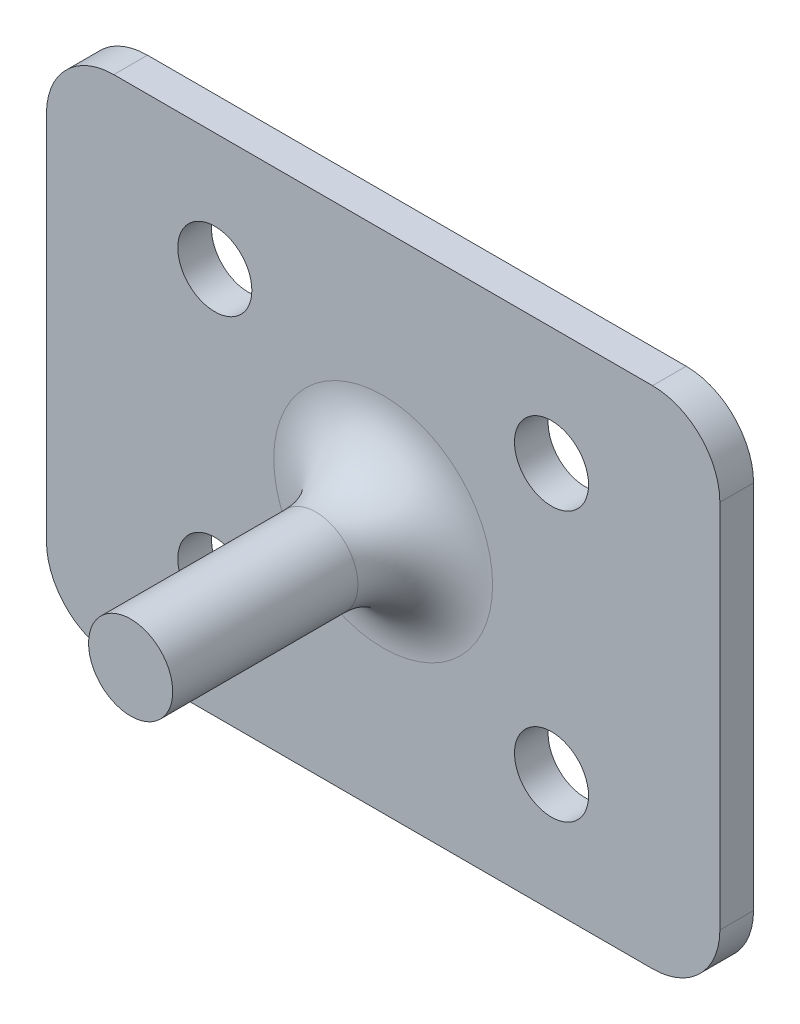
ISO-10303-21;
HEADER;
FILE_DESCRIPTION(('STEP AP214'),'2;1');
FILE_NAME('part.step','',(''),(''),'','','');
FILE_SCHEMA(('AUTOMOTIVE_DESIGN { 1 0 10303 214 1 1 1 1 }'));
ENDSEC;
DATA;
#1=APPLICATION_CONTEXT('core data for automotive mechanical design processes');
#2=APPLICATION_PROTOCOL_DEFINITION('international standard','automotive_design',2000,#1);
#3=PRODUCT_CONTEXT('',#1,'mechanical');
#4=PRODUCT('Part','Part','',(#3));
#5=PRODUCT_RELATED_PRODUCT_CATEGORY('part','',(#4));
#6=PRODUCT_DEFINITION_FORMATION('','',#4);
#7=PRODUCT_DEFINITION_CONTEXT('part definition',#1,'design');
#8=PRODUCT_DEFINITION('design','',#6,#7);
#9=PRODUCT_DEFINITION_SHAPE('','',#8);
#10=(LENGTH_UNIT() NAMED_UNIT(*) SI_UNIT(.MILLI.,.METRE.));
#11=(NAMED_UNIT(*) PLANE_ANGLE_UNIT() SI_UNIT($,.RADIAN.));
#12=(NAMED_UNIT(*) SI_UNIT($,.STERADIAN.) SOLID_ANGLE_UNIT());
#13=UNCERTAINTY_MEASURE_WITH_UNIT(LENGTH_MEASURE(1.E-05),#10,'distance_accuracy_value','');
#14=(GEOMETRIC_REPRESENTATION_CONTEXT(3) GLOBAL_UNCERTAINTY_ASSIGNED_CONTEXT((#13)) GLOBAL_UNIT_ASSIGNED_CONTEXT((#10,
#11,#12)) REPRESENTATION_CONTEXT('',''));
#15=CARTESIAN_POINT('',(0.,0.,0.));
#16=DIRECTION('',(0.,0.,1.));
#17=DIRECTION('',(1.,0.,0.));
#18=AXIS2_PLACEMENT_3D('',#15,#16,#17);
#19=CARTESIAN_POINT('',(16.51,-45.72,2.54));
#20=DIRECTION('',(0.,0.,1.));
#21=DIRECTION('',(1.,0.,0.));
#22=AXIS2_PLACEMENT_3D('',#19,#20,#21);
#23=PLANE('',#22);
#24=CARTESIAN_POINT('',(36.83,-31.75,2.54));
#25=DIRECTION('',(0.,0.,1.));
#26=DIRECTION('',(1.,0.,0.));
#27=AXIS2_PLACEMENT_3D('',#24,#25,#26);
#28=CIRCLE('',#27,8.255);
#29=CARTESIAN_POINT('',(45.085,-31.75,2.54));
#30=VERTEX_POINT('',#29);
#31=EDGE_CURVE('E11',#30,#30,#28,.F.);
#32=ORIENTED_EDGE('',*,*,#31,.T.);
#33=EDGE_LOOP('',(#32));
#34=FACE_BOUND('',#33,.T.);
#35=CARTESIAN_POINT('',(16.51,-45.72,2.54));
#36=DIRECTION('',(0.,0.,1.));
#37=DIRECTION('',(1.,0.,0.));
#38=AXIS2_PLACEMENT_3D('',#35,#36,#37);
#39=CIRCLE('',#38,5.08);
#40=CARTESIAN_POINT('',(11.43,-45.72,2.54));
#41=VERTEX_POINT('',#40);
#42=CARTESIAN_POINT('',(16.51,-50.8,2.54));
#43=VERTEX_POINT('',#42);
#44=EDGE_CURVE('E149',#41,#43,#39,.T.);
#45=ORIENTED_EDGE('',*,*,#44,.T.);
#46=DIRECTION('',(1.,0.,0.));
#47=VECTOR('',#46,1.);
#48=CARTESIAN_POINT('',(16.51,-50.8,2.54));
#49=LINE('',#48,#47);
#50=CARTESIAN_POINT('',(57.15,-50.8,2.54));
#51=VERTEX_POINT('',#50);
#52=EDGE_CURVE('E97',#43,#51,#49,.T.);
#53=ORIENTED_EDGE('',*,*,#52,.T.);
#54=CARTESIAN_POINT('',(57.15,-45.72,2.54));
#55=DIRECTION('',(0.,0.,1.));
#56=DIRECTION('',(1.,0.,0.));
#57=AXIS2_PLACEMENT_3D('',#54,#55,#56);
#58=CIRCLE('',#57,5.08);
#59=CARTESIAN_POINT('',(62.23,-45.72,2.54));
#60=VERTEX_POINT('',#59);
#61=EDGE_CURVE('E223',#51,#60,#58,.T.);
#62=ORIENTED_EDGE('',*,*,#61,.T.);
#63=DIRECTION('',(0.,1.,0.));
#64=VECTOR('',#63,1.);
#65=CARTESIAN_POINT('',(62.23,-17.78,2.54));
#66=LINE('',#65,#64);
#67=CARTESIAN_POINT('',(62.23,-17.78,2.54));
#68=VERTEX_POINT('',#67);
#69=EDGE_CURVE('E228',#60,#68,#66,.T.);
#70=ORIENTED_EDGE('',*,*,#69,.T.);
#71=CARTESIAN_POINT('',(57.15,-17.78,2.54));
#72=DIRECTION('',(0.,0.,1.));
#73=DIRECTION('',(-1.,0.,0.));
#74=AXIS2_PLACEMENT_3D('',#71,#72,#73);
#75=CIRCLE('',#74,5.08);
#76=CARTESIAN_POINT('',(57.15,-12.7,2.54));
#77=VERTEX_POINT('',#76);
#78=EDGE_CURVE('E116',#68,#77,#75,.T.);
#79=ORIENTED_EDGE('',*,*,#78,.T.);
#80=DIRECTION('',(-1.,0.,0.));
#81=VECTOR('',#80,1.);
#82=CARTESIAN_POINT('',(16.51,-12.7,2.54));
#83=LINE('',#82,#81);
#84=CARTESIAN_POINT('',(16.51,-12.7,2.54));
#85=VERTEX_POINT('',#84);
#86=EDGE_CURVE('E110',#77,#85,#83,.T.);
#87=ORIENTED_EDGE('',*,*,#86,.T.);
#88=CARTESIAN_POINT('',(16.51,-17.78,2.54));
#89=DIRECTION('',(0.,0.,1.));
#90=DIRECTION('',(1.,0.,0.));
#91=AXIS2_PLACEMENT_3D('',#88,#89,#90);
#92=CIRCLE('',#91,5.08);
#93=CARTESIAN_POINT('',(11.43,-17.78,2.54));
#94=VERTEX_POINT('',#93);
#95=EDGE_CURVE('E114',#85,#94,#92,.T.);
#96=ORIENTED_EDGE('',*,*,#95,.T.);
#97=DIRECTION('',(0.,-1.,0.));
#98=VECTOR('',#97,1.);
#99=CARTESIAN_POINT('',(11.43,-17.78,2.54));
#100=LINE('',#99,#98);
#101=EDGE_CURVE('E53',#94,#41,#100,.T.);
#102=ORIENTED_EDGE('',*,*,#101,.T.);
#103=EDGE_LOOP('',(#45,#53,#62,#70,#79,#87,#96,#102));
#104=FACE_BOUND('',#103,.T.);
#105=CARTESIAN_POINT('',(24.13,-21.59,2.54));
#106=DIRECTION('',(0.,0.,1.));
#107=DIRECTION('',(1.,0.,0.));
#108=AXIS2_PLACEMENT_3D('',#105,#106,#107);
#109=CIRCLE('',#108,2.794);
#110=CARTESIAN_POINT('',(26.924,-21.59,2.54));
#111=VERTEX_POINT('',#110);
#112=EDGE_CURVE('E234',#111,#111,#109,.T.);
#113=ORIENTED_EDGE('',*,*,#112,.F.);
#114=EDGE_LOOP('',(#113));
#115=FACE_BOUND('',#114,.T.);
#116=CARTESIAN_POINT('',(49.53,-21.59,2.54));
#117=DIRECTION('',(0.,0.,1.));
#118=DIRECTION('',(1.,0.,0.));
#119=AXIS2_PLACEMENT_3D('',#116,#117,#118);
#120=CIRCLE('',#119,2.794);
#121=CARTESIAN_POINT('',(52.324,-21.59,2.54));
#122=VERTEX_POINT('',#121);
#123=EDGE_CURVE('E240',#122,#122,#120,.T.);
#124=ORIENTED_EDGE('',*,*,#123,.F.);
#125=EDGE_LOOP('',(#124));
#126=FACE_BOUND('',#125,.T.);
#127=CARTESIAN_POINT('',(24.13,-41.91,2.54));
#128=DIRECTION('',(0.,0.,1.));
#129=DIRECTION('',(1.,0.,0.));
#130=AXIS2_PLACEMENT_3D('',#127,#128,#129);
#131=CIRCLE('',#130,2.794);
#132=CARTESIAN_POINT('',(26.924,-41.91,2.54));
#133=VERTEX_POINT('',#132);
#134=EDGE_CURVE('E246',#133,#133,#131,.T.);
#135=ORIENTED_EDGE('',*,*,#134,.F.);
#136=EDGE_LOOP('',(#135));
#137=FACE_BOUND('',#136,.T.);
#138=CARTESIAN_POINT('',(49.53,-41.91,2.54));
#139=DIRECTION('',(0.,0.,1.));
#140=DIRECTION('',(1.,0.,0.));
#141=AXIS2_PLACEMENT_3D('',#138,#139,#140);
#142=CIRCLE('',#141,2.794);
#143=CARTESIAN_POINT('',(52.324,-41.91,2.54));
#144=VERTEX_POINT('',#143);
#145=EDGE_CURVE('E252',#144,#144,#142,.T.);
#146=ORIENTED_EDGE('',*,*,#145,.F.);
#147=EDGE_LOOP('',(#146));
#148=FACE_BOUND('',#147,.T.);
#149=ADVANCED_FACE('F36',(#34,#104,#115,#126,#137,#148),#23,.T.);
#150=CARTESIAN_POINT('',(16.51,-45.72,2.54));
#151=DIRECTION('',(0.,0.,-1.));
#152=DIRECTION('',(-1.,0.,0.));
#153=AXIS2_PLACEMENT_3D('',#150,#151,#152);
#154=CYLINDRICAL_SURFACE('',#153,5.08);
#155=CARTESIAN_POINT('',(16.51,-45.72,0.));
#156=DIRECTION('',(0.,0.,1.));
#157=DIRECTION('',(1.,0.,0.));
#158=AXIS2_PLACEMENT_3D('',#155,#156,#157);
#159=CIRCLE('',#158,5.08);
#160=CARTESIAN_POINT('',(11.43,-45.72,0.));
#161=VERTEX_POINT('',#160);
#162=CARTESIAN_POINT('',(16.51,-50.8,0.));
#163=VERTEX_POINT('',#162);
#164=EDGE_CURVE('E134',#161,#163,#159,.T.);
#165=ORIENTED_EDGE('',*,*,#164,.T.);
#166=DIRECTION('',(0.,0.,-1.));
#167=VECTOR('',#166,1.);
#168=CARTESIAN_POINT('',(16.51,-50.8,2.54));
#169=LINE('',#168,#167);
#170=EDGE_CURVE('E162',#43,#163,#169,.T.);
#171=ORIENTED_EDGE('',*,*,#170,.F.);
#172=ORIENTED_EDGE('',*,*,#44,.F.);
#173=DIRECTION('',(0.,0.,-1.));
#174=VECTOR('',#173,1.);
#175=CARTESIAN_POINT('',(11.43,-45.72,2.54));
#176=LINE('',#175,#174);
#177=EDGE_CURVE('E130',#41,#161,#176,.T.);
#178=ORIENTED_EDGE('',*,*,#177,.T.);
#179=EDGE_LOOP('',(#165,#171,#172,#178));
#180=FACE_BOUND('',#179,.T.);
#181=ADVANCED_FACE('F179',(#180),#154,.T.);
#182=CARTESIAN_POINT('',(16.51,-50.8,2.54));
#183=DIRECTION('',(0.,1.,0.));
#184=DIRECTION('',(0.,0.,1.));
#185=AXIS2_PLACEMENT_3D('',#182,#183,#184);
#186=PLANE('',#185);
#187=DIRECTION('',(1.,0.,0.));
#188=VECTOR('',#187,1.);
#189=CARTESIAN_POINT('',(16.51,-50.8,0.));
#190=LINE('',#189,#188);
#191=CARTESIAN_POINT('',(57.15,-50.8,0.));
#192=VERTEX_POINT('',#191);
#193=EDGE_CURVE('E137',#163,#192,#190,.T.);
#194=ORIENTED_EDGE('',*,*,#193,.T.);
#195=DIRECTION('',(0.,0.,-1.));
#196=VECTOR('',#195,1.);
#197=CARTESIAN_POINT('',(57.15,-50.8,2.54));
#198=LINE('',#197,#196);
#199=EDGE_CURVE('E159',#51,#192,#198,.T.);
#200=ORIENTED_EDGE('',*,*,#199,.F.);
#201=ORIENTED_EDGE('',*,*,#52,.F.);
#202=ORIENTED_EDGE('',*,*,#170,.T.);
#203=EDGE_LOOP('',(#194,#200,#201,#202));
#204=FACE_BOUND('',#203,.T.);
#205=ADVANCED_FACE('F185',(#204),#186,.F.);
#206=CARTESIAN_POINT('',(57.15,-45.72,2.54));
#207=DIRECTION('',(0.,0.,-1.));
#208=DIRECTION('',(-1.,0.,0.));
#209=AXIS2_PLACEMENT_3D('',#206,#207,#208);
#210=CYLINDRICAL_SURFACE('',#209,5.08);
#211=CARTESIAN_POINT('',(57.15,-45.72,0.));
#212=DIRECTION('',(0.,0.,1.));
#213=DIRECTION('',(1.,0.,0.));
#214=AXIS2_PLACEMENT_3D('',#211,#212,#213);
#215=CIRCLE('',#214,5.08);
#216=CARTESIAN_POINT('',(62.23,-45.72,0.));
#217=VERTEX_POINT('',#216);
#218=EDGE_CURVE('E140',#192,#217,#215,.T.);
#219=ORIENTED_EDGE('',*,*,#218,.T.);
#220=DIRECTION('',(0.,0.,-1.));
#221=VECTOR('',#220,1.);
#222=CARTESIAN_POINT('',(62.23,-45.72,2.54));
#223=LINE('',#222,#221);
#224=EDGE_CURVE('E156',#60,#217,#223,.T.);
#225=ORIENTED_EDGE('',*,*,#224,.F.);
#226=ORIENTED_EDGE('',*,*,#61,.F.);
#227=ORIENTED_EDGE('',*,*,#199,.T.);
#228=EDGE_LOOP('',(#219,#225,#226,#227));
#229=FACE_BOUND('',#228,.T.);
#230=ADVANCED_FACE('F209',(#229),#210,.T.);
#231=CARTESIAN_POINT('',(62.23,-17.78,2.54));
#232=DIRECTION('',(-1.,0.,0.));
#233=DIRECTION('',(0.,-1.,0.));
#234=AXIS2_PLACEMENT_3D('',#231,#232,#233);
#235=PLANE('',#234);
#236=DIRECTION('',(0.,1.,0.));
#237=VECTOR('',#236,1.);
#238=CARTESIAN_POINT('',(62.23,-17.78,0.));
#239=LINE('',#238,#237);
#240=CARTESIAN_POINT('',(62.23,-17.78,0.));
#241=VERTEX_POINT('',#240);
#242=EDGE_CURVE('E142',#217,#241,#239,.T.);
#243=ORIENTED_EDGE('',*,*,#242,.T.);
#244=DIRECTION('',(0.,0.,-1.));
#245=VECTOR('',#244,1.);
#246=CARTESIAN_POINT('',(62.23,-17.78,2.54));
#247=LINE('',#246,#245);
#248=EDGE_CURVE('E153',#68,#241,#247,.T.);
#249=ORIENTED_EDGE('',*,*,#248,.F.);
#250=ORIENTED_EDGE('',*,*,#69,.F.);
#251=ORIENTED_EDGE('',*,*,#224,.T.);
#252=EDGE_LOOP('',(#243,#249,#250,#251));
#253=FACE_BOUND('',#252,.T.);
#254=ADVANCED_FACE('F205',(#253),#235,.F.);
#255=CARTESIAN_POINT('',(57.15,-17.78,2.54));
#256=DIRECTION('',(0.,0.,-1.));
#257=DIRECTION('',(-1.,0.,0.));
#258=AXIS2_PLACEMENT_3D('',#255,#256,#257);
#259=CYLINDRICAL_SURFACE('',#258,5.08);
#260=CARTESIAN_POINT('',(57.15,-17.78,0.));
#261=DIRECTION('',(0.,0.,1.));
#262=DIRECTION('',(-1.,0.,0.));
#263=AXIS2_PLACEMENT_3D('',#260,#261,#262);
#264=CIRCLE('',#263,5.08);
#265=CARTESIAN_POINT('',(57.15,-12.7,0.));
#266=VERTEX_POINT('',#265);
#267=EDGE_CURVE('E144',#241,#266,#264,.T.);
#268=ORIENTED_EDGE('',*,*,#267,.T.);
#269=DIRECTION('',(0.,0.,-1.));
#270=VECTOR('',#269,1.);
#271=CARTESIAN_POINT('',(57.15,-12.7,2.54));
#272=LINE('',#271,#270);
#273=EDGE_CURVE('E125',#77,#266,#272,.T.);
#274=ORIENTED_EDGE('',*,*,#273,.F.);
#275=ORIENTED_EDGE('',*,*,#78,.F.);
#276=ORIENTED_EDGE('',*,*,#248,.T.);
#277=EDGE_LOOP('',(#268,#274,#275,#276));
#278=FACE_BOUND('',#277,.T.);
#279=ADVANCED_FACE('F202',(#278),#259,.T.);
#280=CARTESIAN_POINT('',(16.51,-12.7,2.54));
#281=DIRECTION('',(0.,-1.,0.));
#282=DIRECTION('',(1.,0.,0.));
#283=AXIS2_PLACEMENT_3D('',#280,#281,#282);
#284=PLANE('',#283);
#285=DIRECTION('',(-1.,0.,0.));
#286=VECTOR('',#285,1.);
#287=CARTESIAN_POINT('',(16.51,-12.7,0.));
#288=LINE('',#287,#286);
#289=CARTESIAN_POINT('',(16.51,-12.7,0.));
#290=VERTEX_POINT('',#289);
#291=EDGE_CURVE('E124',#266,#290,#288,.T.);
#292=ORIENTED_EDGE('',*,*,#291,.T.);
#293=DIRECTION('',(0.,0.,-1.));
#294=VECTOR('',#293,1.);
#295=CARTESIAN_POINT('',(16.51,-12.7,2.54));
#296=LINE('',#295,#294);
#297=EDGE_CURVE('E121',#85,#290,#296,.T.);
#298=ORIENTED_EDGE('',*,*,#297,.F.);
#299=ORIENTED_EDGE('',*,*,#86,.F.);
#300=ORIENTED_EDGE('',*,*,#273,.T.);
#301=EDGE_LOOP('',(#292,#298,#299,#300));
#302=FACE_BOUND('',#301,.T.);
#303=ADVANCED_FACE('F122',(#302),#284,.F.);
#304=CARTESIAN_POINT('',(16.51,-17.78,2.54));
#305=DIRECTION('',(0.,0.,-1.));
#306=DIRECTION('',(-1.,0.,0.));
#307=AXIS2_PLACEMENT_3D('',#304,#305,#306);
#308=CYLINDRICAL_SURFACE('',#307,5.08);
#309=CARTESIAN_POINT('',(16.51,-17.78,0.));
#310=DIRECTION('',(0.,0.,1.));
#311=DIRECTION('',(1.,0.,0.));
#312=AXIS2_PLACEMENT_3D('',#309,#310,#311);
#313=CIRCLE('',#312,5.08);
#314=CARTESIAN_POINT('',(11.43,-17.78,0.));
#315=VERTEX_POINT('',#314);
#316=EDGE_CURVE('E82',#290,#315,#313,.T.);
#317=ORIENTED_EDGE('',*,*,#316,.T.);
#318=DIRECTION('',(0.,0.,-1.));
#319=VECTOR('',#318,1.);
#320=CARTESIAN_POINT('',(11.43,-17.78,2.54));
#321=LINE('',#320,#319);
#322=EDGE_CURVE('E126',#94,#315,#321,.T.);
#323=ORIENTED_EDGE('',*,*,#322,.F.);
#324=ORIENTED_EDGE('',*,*,#95,.F.);
#325=ORIENTED_EDGE('',*,*,#297,.T.);
#326=EDGE_LOOP('',(#317,#323,#324,#325));
#327=FACE_BOUND('',#326,.T.);
#328=ADVANCED_FACE('F128',(#327),#308,.T.);
#329=CARTESIAN_POINT('',(11.43,-17.78,2.54));
#330=DIRECTION('',(1.,0.,0.));
#331=DIRECTION('',(0.,1.,0.));
#332=AXIS2_PLACEMENT_3D('',#329,#330,#331);
#333=PLANE('',#332);
#334=DIRECTION('',(0.,-1.,0.));
#335=VECTOR('',#334,1.);
#336=CARTESIAN_POINT('',(11.43,-17.78,0.));
#337=LINE('',#336,#335);
#338=EDGE_CURVE('E88',#315,#161,#337,.T.);
#339=ORIENTED_EDGE('',*,*,#338,.T.);
#340=ORIENTED_EDGE('',*,*,#177,.F.);
#341=ORIENTED_EDGE('',*,*,#101,.F.);
#342=ORIENTED_EDGE('',*,*,#322,.T.);
#343=EDGE_LOOP('',(#339,#340,#341,#342));
#344=FACE_BOUND('',#343,.T.);
#345=ADVANCED_FACE('F194',(#344),#333,.F.);
#346=CARTESIAN_POINT('',(16.51,-45.72,0.));
#347=DIRECTION('',(0.,0.,1.));
#348=DIRECTION('',(1.,0.,0.));
#349=AXIS2_PLACEMENT_3D('',#346,#347,#348);
#350=PLANE('',#349);
#351=CARTESIAN_POINT('',(49.53,-41.91,0.));
#352=DIRECTION('',(0.,0.,1.));
#353=DIRECTION('',(1.,0.,0.));
#354=AXIS2_PLACEMENT_3D('',#351,#352,#353);
#355=CIRCLE('',#354,2.794);
#356=CARTESIAN_POINT('',(52.324,-41.91,0.));
#357=VERTEX_POINT('',#356);
#358=EDGE_CURVE('E249',#357,#357,#355,.T.);
#359=ORIENTED_EDGE('',*,*,#358,.T.);
#360=EDGE_LOOP('',(#359));
#361=FACE_BOUND('',#360,.T.);
#362=CARTESIAN_POINT('',(24.13,-41.91,0.));
#363=DIRECTION('',(0.,0.,1.));
#364=DIRECTION('',(1.,0.,0.));
#365=AXIS2_PLACEMENT_3D('',#362,#363,#364);
#366=CIRCLE('',#365,2.794);
#367=CARTESIAN_POINT('',(26.924,-41.91,0.));
#368=VERTEX_POINT('',#367);
#369=EDGE_CURVE('E243',#368,#368,#366,.T.);
#370=ORIENTED_EDGE('',*,*,#369,.T.);
#371=EDGE_LOOP('',(#370));
#372=FACE_BOUND('',#371,.T.);
#373=CARTESIAN_POINT('',(49.53,-21.59,0.));
#374=DIRECTION('',(0.,0.,1.));
#375=DIRECTION('',(1.,0.,0.));
#376=AXIS2_PLACEMENT_3D('',#373,#374,#375);
#377=CIRCLE('',#376,2.794);
#378=CARTESIAN_POINT('',(52.324,-21.59,0.));
#379=VERTEX_POINT('',#378);
#380=EDGE_CURVE('E237',#379,#379,#377,.T.);
#381=ORIENTED_EDGE('',*,*,#380,.T.);
#382=EDGE_LOOP('',(#381));
#383=FACE_BOUND('',#382,.T.);
#384=CARTESIAN_POINT('',(24.13,-21.59,0.));
#385=DIRECTION('',(0.,0.,1.));
#386=DIRECTION('',(1.,0.,0.));
#387=AXIS2_PLACEMENT_3D('',#384,#385,#386);
#388=CIRCLE('',#387,2.794);
#389=CARTESIAN_POINT('',(26.924,-21.59,0.));
#390=VERTEX_POINT('',#389);
#391=EDGE_CURVE('E138',#390,#390,#388,.T.);
#392=ORIENTED_EDGE('',*,*,#391,.T.);
#393=EDGE_LOOP('',(#392));
#394=FACE_BOUND('',#393,.T.);
#395=ORIENTED_EDGE('',*,*,#164,.F.);
#396=ORIENTED_EDGE('',*,*,#338,.F.);
#397=ORIENTED_EDGE('',*,*,#316,.F.);
#398=ORIENTED_EDGE('',*,*,#291,.F.);
#399=ORIENTED_EDGE('',*,*,#267,.F.);
#400=ORIENTED_EDGE('',*,*,#242,.F.);
#401=ORIENTED_EDGE('',*,*,#218,.F.);
#402=ORIENTED_EDGE('',*,*,#193,.F.);
#403=EDGE_LOOP('',(#395,#396,#397,#398,#399,#400,#401,#402));
#404=FACE_BOUND('',#403,.T.);
#405=ADVANCED_FACE('F191',(#361,#372,#383,#394,#404),#350,.F.);
#406=CARTESIAN_POINT('',(24.13,-21.59,0.));
#407=DIRECTION('',(0.,0.,1.));
#408=DIRECTION('',(1.,0.,0.));
#409=AXIS2_PLACEMENT_3D('',#406,#407,#408);
#410=CYLINDRICAL_SURFACE('',#409,2.794);
#411=ORIENTED_EDGE('',*,*,#391,.F.);
#412=EDGE_LOOP('',(#411));
#413=FACE_BOUND('',#412,.T.);
#414=ORIENTED_EDGE('',*,*,#112,.T.);
#415=EDGE_LOOP('',(#414));
#416=FACE_BOUND('',#415,.T.);
#417=ADVANCED_FACE('F189',(#413,#416),#410,.F.);
#418=CARTESIAN_POINT('',(49.53,-21.59,0.));
#419=DIRECTION('',(0.,0.,1.));
#420=DIRECTION('',(1.,0.,0.));
#421=AXIS2_PLACEMENT_3D('',#418,#419,#420);
#422=CYLINDRICAL_SURFACE('',#421,2.794);
#423=ORIENTED_EDGE('',*,*,#380,.F.);
#424=EDGE_LOOP('',(#423));
#425=FACE_BOUND('',#424,.T.);
#426=ORIENTED_EDGE('',*,*,#123,.T.);
#427=EDGE_LOOP('',(#426));
#428=FACE_BOUND('',#427,.T.);
#429=ADVANCED_FACE('F271',(#425,#428),#422,.F.);
#430=CARTESIAN_POINT('',(24.13,-41.91,0.));
#431=DIRECTION('',(0.,0.,1.));
#432=DIRECTION('',(1.,0.,0.));
#433=AXIS2_PLACEMENT_3D('',#430,#431,#432);
#434=CYLINDRICAL_SURFACE('',#433,2.794);
#435=ORIENTED_EDGE('',*,*,#369,.F.);
#436=EDGE_LOOP('',(#435));
#437=FACE_BOUND('',#436,.T.);
#438=ORIENTED_EDGE('',*,*,#134,.T.);
#439=EDGE_LOOP('',(#438));
#440=FACE_BOUND('',#439,.T.);
#441=ADVANCED_FACE('F266',(#437,#440),#434,.F.);
#442=CARTESIAN_POINT('',(49.53,-41.91,0.));
#443=DIRECTION('',(0.,0.,1.));
#444=DIRECTION('',(1.,0.,0.));
#445=AXIS2_PLACEMENT_3D('',#442,#443,#444);
#446=CYLINDRICAL_SURFACE('',#445,2.794);
#447=ORIENTED_EDGE('',*,*,#358,.F.);
#448=EDGE_LOOP('',(#447));
#449=FACE_BOUND('',#448,.T.);
#450=ORIENTED_EDGE('',*,*,#145,.T.);
#451=EDGE_LOOP('',(#450));
#452=FACE_BOUND('',#451,.T.);
#453=ADVANCED_FACE('F261',(#449,#452),#446,.F.);
#454=CARTESIAN_POINT('',(36.83,-31.75,21.59));
#455=DIRECTION('',(0.,0.,-1.));
#456=DIRECTION('',(-1.,0.,0.));
#457=AXIS2_PLACEMENT_3D('',#454,#455,#456);
#458=CYLINDRICAL_SURFACE('',#457,3.175);
#459=CARTESIAN_POINT('',(36.83,-31.75,7.62));
#460=DIRECTION('',(0.,0.,1.));
#461=DIRECTION('',(1.,0.,0.));
#462=AXIS2_PLACEMENT_3D('',#459,#460,#461);
#463=CIRCLE('',#462,3.175);
#464=CARTESIAN_POINT('',(33.655,-31.75,7.62));
#465=VERTEX_POINT('',#464);
#466=EDGE_CURVE('E45',#465,#465,#463,.T.);
#467=CARTESIAN_POINT('',(36.83,-31.75,21.59));
#468=DIRECTION('',(0.,0.,1.));
#469=DIRECTION('',(1.,0.,0.));
#470=AXIS2_PLACEMENT_3D('',#467,#468,#469);
#471=CIRCLE('',#470,3.175);
#472=CARTESIAN_POINT('',(33.655,-31.75,21.59));
#473=VERTEX_POINT('',#472);
#474=EDGE_CURVE('E255',#473,#473,#471,.T.);
#475=CARTESIAN_POINT('',(33.655,-31.75,7.62));
#476=CARTESIAN_POINT('',(33.655,-31.75,7.76552083333333));
#477=CARTESIAN_POINT('',(33.655,-31.75,7.91104166666667));
#478=CARTESIAN_POINT('',(33.655,-31.75,8.20208333333333));
#479=CARTESIAN_POINT('',(33.655,-31.75,8.34760416666667));
#480=CARTESIAN_POINT('',(33.655,-31.75,8.63864583333333));
#481=CARTESIAN_POINT('',(33.655,-31.75,8.78416666666667));
#482=CARTESIAN_POINT('',(33.655,-31.75,9.07520833333333));
#483=CARTESIAN_POINT('',(33.655,-31.75,9.22072916666667));
#484=CARTESIAN_POINT('',(33.655,-31.75,9.51177083333333));
#485=CARTESIAN_POINT('',(33.655,-31.75,9.65729166666667));
#486=CARTESIAN_POINT('',(33.655,-31.75,9.94833333333333));
#487=CARTESIAN_POINT('',(33.655,-31.75,10.0938541666667));
#488=CARTESIAN_POINT('',(33.655,-31.75,10.3848958333333));
#489=CARTESIAN_POINT('',(33.655,-31.75,10.5304166666667));
#490=CARTESIAN_POINT('',(33.655,-31.75,10.8214583333333));
#491=CARTESIAN_POINT('',(33.655,-31.75,10.9669791666667));
#492=CARTESIAN_POINT('',(33.655,-31.75,11.2580208333333));
#493=CARTESIAN_POINT('',(33.655,-31.75,11.4035416666667));
#494=CARTESIAN_POINT('',(33.655,-31.75,11.6945833333333));
#495=CARTESIAN_POINT('',(33.655,-31.75,11.8401041666667));
#496=CARTESIAN_POINT('',(33.655,-31.75,12.1311458333333));
#497=CARTESIAN_POINT('',(33.655,-31.75,12.2766666666667));
#498=CARTESIAN_POINT('',(33.655,-31.75,12.5677083333333));
#499=CARTESIAN_POINT('',(33.655,-31.75,12.7132291666667));
#500=CARTESIAN_POINT('',(33.655,-31.75,13.0042708333333));
#501=CARTESIAN_POINT('',(33.655,-31.75,13.1497916666667));
#502=CARTESIAN_POINT('',(33.655,-31.75,13.4408333333333));
#503=CARTESIAN_POINT('',(33.655,-31.75,13.5863541666667));
#504=CARTESIAN_POINT('',(33.655,-31.75,13.8773958333333));
#505=CARTESIAN_POINT('',(33.655,-31.75,14.0229166666667));
#506=CARTESIAN_POINT('',(33.655,-31.75,14.3139583333333));
#507=CARTESIAN_POINT('',(33.655,-31.75,14.4594791666667));
#508=CARTESIAN_POINT('',(33.655,-31.75,14.7505208333333));
#509=CARTESIAN_POINT('',(33.655,-31.75,14.8960416666667));
#510=CARTESIAN_POINT('',(33.655,-31.75,15.1870833333333));
#511=CARTESIAN_POINT('',(33.655,-31.75,15.3326041666667));
#512=CARTESIAN_POINT('',(33.655,-31.75,15.6236458333333));
#513=CARTESIAN_POINT('',(33.655,-31.75,15.7691666666667));
#514=CARTESIAN_POINT('',(33.655,-31.75,16.0602083333333));
#515=CARTESIAN_POINT('',(33.655,-31.75,16.2057291666667));
#516=CARTESIAN_POINT('',(33.655,-31.75,16.4967708333333));
#517=CARTESIAN_POINT('',(33.655,-31.75,16.6422916666667));
#518=CARTESIAN_POINT('',(33.655,-31.75,16.9333333333333));
#519=CARTESIAN_POINT('',(33.655,-31.75,17.0788541666667));
#520=CARTESIAN_POINT('',(33.655,-31.75,17.3698958333333));
#521=CARTESIAN_POINT('',(33.655,-31.75,17.5154166666667));
#522=CARTESIAN_POINT('',(33.655,-31.75,17.8064583333333));
#523=CARTESIAN_POINT('',(33.655,-31.75,17.9519791666667));
#524=CARTESIAN_POINT('',(33.655,-31.75,18.2430208333333));
#525=CARTESIAN_POINT('',(33.655,-31.75,18.3885416666667));
#526=CARTESIAN_POINT('',(33.655,-31.75,18.6795833333333));
#527=CARTESIAN_POINT('',(33.655,-31.75,18.8251041666667));
#528=CARTESIAN_POINT('',(33.655,-31.75,19.1161458333333));
#529=CARTESIAN_POINT('',(33.655,-31.75,19.2616666666667));
#530=CARTESIAN_POINT('',(33.655,-31.75,19.5527083333333));
#531=CARTESIAN_POINT('',(33.655,-31.75,19.6982291666667));
#532=CARTESIAN_POINT('',(33.655,-31.75,19.9892708333333));
#533=CARTESIAN_POINT('',(33.655,-31.75,20.1347916666667));
#534=CARTESIAN_POINT('',(33.655,-31.75,20.4258333333333));
#535=CARTESIAN_POINT('',(33.655,-31.75,20.5713541666667));
#536=CARTESIAN_POINT('',(33.655,-31.75,20.8623958333333));
#537=CARTESIAN_POINT('',(33.655,-31.75,21.0079166666667));
#538=CARTESIAN_POINT('',(33.655,-31.75,21.2989583333333));
#539=CARTESIAN_POINT('',(33.655,-31.75,21.4444791666667));
#540=CARTESIAN_POINT('',(33.655,-31.75,21.59));
#541=B_SPLINE_CURVE_WITH_KNOTS('',3,(#475,#476,#477,#478,#479,#480,#481,#482,#483,#484,#485,
#486,#487,#488,#489,#490,#491,#492,#493,#494,#495,#496,#497,#498,#499,#500,#501,#502,#503,#504,
#505,#506,#507,#508,#509,#510,#511,#512,#513,#514,#515,#516,#517,#518,#519,#520,#521,#522,#523,
#524,#525,#526,#527,#528,#529,#530,#531,#532,#533,#534,#535,#536,#537,#538,#539,#540),
.UNSPECIFIED.,.F.,.F.,(4,2,2,2,2,2,2,2,2,2,2,2,2,2,2,2,2,2,2,2,2,2,2,2,2,2,2,2,2,2,2,2,4),(0.,
0.436562499999999,0.873125000000001,1.3096875,1.74625,2.1828125,2.619375,3.0559375,3.4925,
3.9290625,4.365625,4.8021875,5.23875,5.6753125,6.111875,6.5484375,6.985,7.4215625,7.858125,
8.2946875,8.73125,9.1678125,9.604375,10.0409375,10.4775,10.9140625,11.350625,11.7871875,
12.22375,12.6603125,13.096875,13.5334375,13.97),.UNSPECIFIED.);
#542=EDGE_CURVE('BSEAM166',#465,#473,#541,.T.);
#543=ORIENTED_EDGE('',*,*,#466,.T.);
#544=ORIENTED_EDGE('',*,*,#474,.F.);
#545=ORIENTED_EDGE('',*,*,#542,.T.);
#546=ORIENTED_EDGE('',*,*,#542,.F.);
#547=EDGE_LOOP('',(#543,#545,#544,#546));
#548=FACE_BOUND('',#547,.T.);
#549=ADVANCED_FACE('F166',(#548),#458,.T.);
#550=CARTESIAN_POINT('',(36.83,-31.75,21.59));
#551=DIRECTION('',(0.,0.,1.));
#552=DIRECTION('',(1.,0.,0.));
#553=AXIS2_PLACEMENT_3D('',#550,#551,#552);
#554=PLANE('',#553);
#555=ORIENTED_EDGE('',*,*,#474,.T.);
#556=EDGE_LOOP('',(#555));
#557=FACE_BOUND('',#556,.T.);
#558=ADVANCED_FACE('F170',(#557),#554,.T.);
#559=CARTESIAN_POINT('',(36.83,-31.75,7.62));
#560=DIRECTION('',(0.,0.,1.));
#561=DIRECTION('',(1.,0.,0.));
#562=AXIS2_PLACEMENT_3D('',#559,#560,#561);
#563=TOROIDAL_SURFACE('',#562,8.255,5.08);
#564=ORIENTED_EDGE('',*,*,#31,.F.);
#565=EDGE_LOOP('',(#564));
#566=FACE_BOUND('',#565,.T.);
#567=ORIENTED_EDGE('',*,*,#466,.F.);
#568=EDGE_LOOP('',(#567));
#569=FACE_BOUND('',#568,.T.);
#570=ADVANCED_FACE('F38',(#566,#569),#563,.F.);
#571=CLOSED_SHELL('',(#149,#181,#205,#230,#254,#279,#303,#328,#345,#405,#417,#429,#441,#453,
#549,#558,#570));
#572=MANIFOLD_SOLID_BREP('B2',#571);
#573=ADVANCED_BREP_SHAPE_REPRESENTATION('',(#18,#572),#14);
#574=SHAPE_DEFINITION_REPRESENTATION(#9,#573);
ENDSEC;
END-ISO-10303-21;
